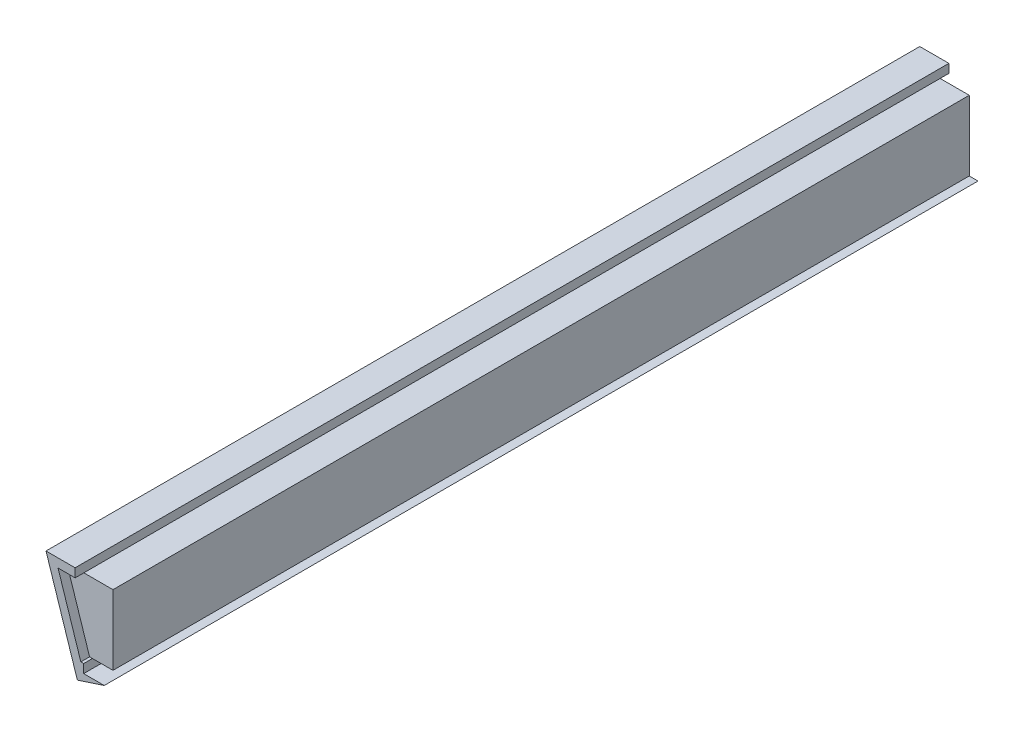
ISO-10303-21;
HEADER;
FILE_DESCRIPTION(('STEP AP214'),'2;1');
FILE_NAME('part.step','',(''),(''),'','','');
FILE_SCHEMA(('AUTOMOTIVE_DESIGN { 1 0 10303 214 1 1 1 1 }'));
ENDSEC;
DATA;
#1=APPLICATION_CONTEXT('core data for automotive mechanical design processes');
#2=APPLICATION_PROTOCOL_DEFINITION('international standard','automotive_design',2000,#1);
#3=PRODUCT_CONTEXT('',#1,'mechanical');
#4=PRODUCT('Part','Part','',(#3));
#5=PRODUCT_RELATED_PRODUCT_CATEGORY('part','',(#4));
#6=PRODUCT_DEFINITION_FORMATION('','',#4);
#7=PRODUCT_DEFINITION_CONTEXT('part definition',#1,'design');
#8=PRODUCT_DEFINITION('design','',#6,#7);
#9=PRODUCT_DEFINITION_SHAPE('','',#8);
#10=(LENGTH_UNIT() NAMED_UNIT(*) SI_UNIT(.MILLI.,.METRE.));
#11=(NAMED_UNIT(*) PLANE_ANGLE_UNIT() SI_UNIT($,.RADIAN.));
#12=(NAMED_UNIT(*) SI_UNIT($,.STERADIAN.) SOLID_ANGLE_UNIT());
#13=UNCERTAINTY_MEASURE_WITH_UNIT(LENGTH_MEASURE(1.E-05),#10,'distance_accuracy_value','');
#14=(GEOMETRIC_REPRESENTATION_CONTEXT(3) GLOBAL_UNCERTAINTY_ASSIGNED_CONTEXT((#13)) GLOBAL_UNIT_ASSIGNED_CONTEXT((#10,
#11,#12)) REPRESENTATION_CONTEXT('',''));
#15=CARTESIAN_POINT('',(0.,0.,0.));
#16=DIRECTION('',(0.,0.,1.));
#17=DIRECTION('',(1.,0.,0.));
#18=AXIS2_PLACEMENT_3D('',#15,#16,#17);
#19=CARTESIAN_POINT('',(0.,293.,-300.));
#20=DIRECTION('',(0.,-1.,0.));
#21=DIRECTION('',(0.,0.,-1.));
#22=AXIS2_PLACEMENT_3D('',#19,#20,#21);
#23=PLANE('',#22);
#24=DIRECTION('',(-1.,0.,0.));
#25=VECTOR('',#24,1.);
#26=CARTESIAN_POINT('',(0.,293.,-3.));
#27=LINE('',#26,#25);
#28=CARTESIAN_POINT('',(-85.9380792356703,293.,-3.));
#29=VERTEX_POINT('',#28);
#30=CARTESIAN_POINT('',(-95.9380792356703,293.,-3.));
#31=VERTEX_POINT('',#30);
#32=EDGE_CURVE('E256',#29,#31,#27,.T.);
#33=ORIENTED_EDGE('',*,*,#32,.F.);
#34=DIRECTION('',(0.,0.,1.));
#35=VECTOR('',#34,1.);
#36=CARTESIAN_POINT('',(-85.9380792356703,293.,-300.));
#37=LINE('',#36,#35);
#38=CARTESIAN_POINT('',(-85.9380792356703,293.,-297.));
#39=VERTEX_POINT('',#38);
#40=EDGE_CURVE('E151',#39,#29,#37,.T.);
#41=ORIENTED_EDGE('',*,*,#40,.F.);
#42=DIRECTION('',(-1.,0.,0.));
#43=VECTOR('',#42,1.);
#44=CARTESIAN_POINT('',(0.,293.,-297.));
#45=LINE('',#44,#43);
#46=CARTESIAN_POINT('',(-95.9380792356703,293.,-297.));
#47=VERTEX_POINT('',#46);
#48=EDGE_CURVE('E221',#39,#47,#45,.T.);
#49=ORIENTED_EDGE('',*,*,#48,.T.);
#50=DIRECTION('',(0.,0.,1.));
#51=VECTOR('',#50,1.);
#52=CARTESIAN_POINT('',(-95.9380792356703,293.,-300.));
#53=LINE('',#52,#51);
#54=EDGE_CURVE('E150',#47,#31,#53,.T.);
#55=ORIENTED_EDGE('',*,*,#54,.T.);
#56=EDGE_LOOP('',(#33,#41,#49,#55));
#57=FACE_BOUND('',#56,.T.);
#58=ADVANCED_FACE('F35',(#57),#23,.F.);
#59=CARTESIAN_POINT('',(-85.9380792356703,0.,-300.));
#60=DIRECTION('',(-1.,0.,0.));
#61=DIRECTION('',(0.,0.,1.));
#62=AXIS2_PLACEMENT_3D('',#59,#60,#61);
#63=PLANE('',#62);
#64=DIRECTION('',(0.,1.,0.));
#65=VECTOR('',#64,1.);
#66=CARTESIAN_POINT('',(-85.9380792356703,0.,-3.));
#67=LINE('',#66,#65);
#68=CARTESIAN_POINT('',(-85.9380792356703,269.,-3.));
#69=VERTEX_POINT('',#68);
#70=EDGE_CURVE('E275',#69,#29,#67,.T.);
#71=ORIENTED_EDGE('',*,*,#70,.F.);
#72=DIRECTION('',(0.,0.,1.));
#73=VECTOR('',#72,1.);
#74=CARTESIAN_POINT('',(-85.9380792356703,269.,-300.));
#75=LINE('',#74,#73);
#76=CARTESIAN_POINT('',(-85.9380792356703,269.,-297.));
#77=VERTEX_POINT('',#76);
#78=EDGE_CURVE('E154',#77,#69,#75,.T.);
#79=ORIENTED_EDGE('',*,*,#78,.F.);
#80=DIRECTION('',(0.,-1.,0.));
#81=VECTOR('',#80,1.);
#82=CARTESIAN_POINT('',(-85.9380792356703,0.,-297.));
#83=LINE('',#82,#81);
#84=EDGE_CURVE('E224',#39,#77,#83,.T.);
#85=ORIENTED_EDGE('',*,*,#84,.F.);
#86=ORIENTED_EDGE('',*,*,#40,.T.);
#87=EDGE_LOOP('',(#71,#79,#85,#86));
#88=FACE_BOUND('',#87,.T.);
#89=ADVANCED_FACE('F272',(#88),#63,.F.);
#90=CARTESIAN_POINT('',(0.,269.,-300.));
#91=DIRECTION('',(0.,1.,0.));
#92=DIRECTION('',(0.,0.,1.));
#93=AXIS2_PLACEMENT_3D('',#90,#91,#92);
#94=PLANE('',#93);
#95=DIRECTION('',(-1.,0.,0.));
#96=VECTOR('',#95,1.);
#97=CARTESIAN_POINT('',(0.,269.,-3.));
#98=LINE('',#97,#96);
#99=CARTESIAN_POINT('',(-93.0000000000001,269.,-3.));
#100=VERTEX_POINT('',#99);
#101=EDGE_CURVE('E202',#69,#100,#98,.T.);
#102=ORIENTED_EDGE('',*,*,#101,.T.);
#103=DIRECTION('',(0.,0.,1.));
#104=VECTOR('',#103,1.);
#105=CARTESIAN_POINT('',(-93.0000000000001,269.,-300.));
#106=LINE('',#105,#104);
#107=CARTESIAN_POINT('',(-93.0000000000001,269.,-297.));
#108=VERTEX_POINT('',#107);
#109=EDGE_CURVE('E160',#108,#100,#106,.T.);
#110=ORIENTED_EDGE('',*,*,#109,.F.);
#111=DIRECTION('',(-1.,0.,0.));
#112=VECTOR('',#111,1.);
#113=CARTESIAN_POINT('',(0.,269.,-297.));
#114=LINE('',#113,#112);
#115=EDGE_CURVE('E213',#77,#108,#114,.T.);
#116=ORIENTED_EDGE('',*,*,#115,.F.);
#117=ORIENTED_EDGE('',*,*,#78,.T.);
#118=EDGE_LOOP('',(#102,#110,#116,#117));
#119=FACE_BOUND('',#118,.T.);
#120=ADVANCED_FACE('F279',(#119),#94,.F.);
#121=CARTESIAN_POINT('',(0.,0.,0.));
#122=DIRECTION('',(0.,0.,1.));
#123=DIRECTION('',(1.,0.,0.));
#124=AXIS2_PLACEMENT_3D('',#121,#122,#123);
#125=PLANE('',#124);
#126=DIRECTION('',(0.,-1.,0.));
#127=VECTOR('',#126,1.);
#128=CARTESIAN_POINT('',(-93.0000000000001,0.,0.));
#129=LINE('',#128,#127);
#130=CARTESIAN_POINT('',(-93.0000000000001,269.,0.));
#131=VERTEX_POINT('',#130);
#132=CARTESIAN_POINT('',(-93.0000000000001,266.,0.));
#133=VERTEX_POINT('',#132);
#134=EDGE_CURVE('E138',#131,#133,#129,.T.);
#135=ORIENTED_EDGE('',*,*,#134,.F.);
#136=DIRECTION('',(-1.,0.,0.));
#137=VECTOR('',#136,1.);
#138=CARTESIAN_POINT('',(0.,269.,0.));
#139=LINE('',#138,#137);
#140=CARTESIAN_POINT('',(-93.9782608695652,269.,0.));
#141=VERTEX_POINT('',#140);
#142=EDGE_CURVE('E11',#131,#141,#139,.T.);
#143=ORIENTED_EDGE('',*,*,#142,.T.);
#144=DIRECTION('',(-0.310020599830913,0.95072983948148,0.));
#145=VECTOR('',#144,1.);
#146=CARTESIAN_POINT('',(-5.65912003417447,-1.84536522853513,0.));
#147=LINE('',#146,#145);
#148=CARTESIAN_POINT('',(-101.804347826087,293.,0.));
#149=VERTEX_POINT('',#148);
#150=EDGE_CURVE('E190',#141,#149,#147,.T.);
#151=ORIENTED_EDGE('',*,*,#150,.T.);
#152=DIRECTION('',(-1.,0.,0.));
#153=VECTOR('',#152,1.);
#154=CARTESIAN_POINT('',(0.,293.,0.));
#155=LINE('',#154,#153);
#156=CARTESIAN_POINT('',(-95.9380792356703,293.,0.));
#157=VERTEX_POINT('',#156);
#158=EDGE_CURVE('E43',#157,#149,#155,.T.);
#159=ORIENTED_EDGE('',*,*,#158,.F.);
#160=DIRECTION('',(0.,-1.,0.));
#161=VECTOR('',#160,1.);
#162=CARTESIAN_POINT('',(-95.9380792356703,0.,0.));
#163=LINE('',#162,#161);
#164=CARTESIAN_POINT('',(-95.9380792356703,296.,0.));
#165=VERTEX_POINT('',#164);
#166=EDGE_CURVE('E140',#165,#157,#163,.T.);
#167=ORIENTED_EDGE('',*,*,#166,.F.);
#168=DIRECTION('',(-1.,0.,0.));
#169=VECTOR('',#168,1.);
#170=CARTESIAN_POINT('',(0.,296.,0.));
#171=LINE('',#170,#169);
#172=CARTESIAN_POINT('',(-105.93807923567,296.,0.));
#173=VERTEX_POINT('',#172);
#174=EDGE_CURVE('E108',#165,#173,#171,.T.);
#175=ORIENTED_EDGE('',*,*,#174,.T.);
#176=DIRECTION('',(-0.310020599830914,0.95072983948148,0.));
#177=VECTOR('',#176,1.);
#178=CARTESIAN_POINT('',(-8.51130955261818,-2.77542702802764,0.));
#179=LINE('',#178,#177);
#180=CARTESIAN_POINT('',(-95.1734487358835,262.988466467322,0.));
#181=VERTEX_POINT('',#180);
#182=EDGE_CURVE('E87',#181,#173,#179,.T.);
#183=ORIENTED_EDGE('',*,*,#182,.F.);
#184=DIRECTION('',(-0.950729839481482,-0.310020599830907,0.));
#185=VECTOR('',#184,1.);
#186=CARTESIAN_POINT('',(-86.6621391832632,265.76389349535,0.));
#187=LINE('',#186,#185);
#188=CARTESIAN_POINT('',(-85.9380792356703,266.,0.));
#189=VERTEX_POINT('',#188);
#190=EDGE_CURVE('E132',#189,#181,#187,.T.);
#191=ORIENTED_EDGE('',*,*,#190,.F.);
#192=DIRECTION('',(1.,0.,0.));
#193=VECTOR('',#192,1.);
#194=CARTESIAN_POINT('',(0.,266.,0.));
#195=LINE('',#194,#193);
#196=EDGE_CURVE('E135',#133,#189,#195,.T.);
#197=ORIENTED_EDGE('',*,*,#196,.F.);
#198=EDGE_LOOP('',(#135,#143,#151,#159,#167,#175,#183,#191,#197));
#199=FACE_BOUND('',#198,.T.);
#200=ADVANCED_FACE('F197',(#199),#125,.T.);
#201=CARTESIAN_POINT('',(-86.6621391832632,265.76389349535,-300.));
#202=DIRECTION('',(-0.310020599830907,0.950729839481482,0.));
#203=DIRECTION('',(-0.950729839481482,-0.310020599830907,0.));
#204=AXIS2_PLACEMENT_3D('',#201,#202,#203);
#205=PLANE('',#204);
#206=ORIENTED_EDGE('',*,*,#190,.T.);
#207=DIRECTION('',(0.,0.,1.));
#208=VECTOR('',#207,1.);
#209=CARTESIAN_POINT('',(-95.1734487358835,262.988466467322,-300.));
#210=LINE('',#209,#208);
#211=CARTESIAN_POINT('',(-95.1734487358835,262.988466467322,-300.));
#212=VERTEX_POINT('',#211);
#213=EDGE_CURVE('E145',#212,#181,#210,.T.);
#214=ORIENTED_EDGE('',*,*,#213,.F.);
#215=DIRECTION('',(-0.950729839481482,-0.310020599830907,0.));
#216=VECTOR('',#215,1.);
#217=CARTESIAN_POINT('',(-86.6621391832632,265.76389349535,-300.));
#218=LINE('',#217,#216);
#219=CARTESIAN_POINT('',(-85.9380792356703,266.,-300.));
#220=VERTEX_POINT('',#219);
#221=EDGE_CURVE('E144',#220,#212,#218,.T.);
#222=ORIENTED_EDGE('',*,*,#221,.F.);
#223=DIRECTION('',(0.,0.,1.));
#224=VECTOR('',#223,1.);
#225=CARTESIAN_POINT('',(-85.9380792356703,266.,-300.));
#226=LINE('',#225,#224);
#227=EDGE_CURVE('E128',#220,#189,#226,.T.);
#228=ORIENTED_EDGE('',*,*,#227,.T.);
#229=EDGE_LOOP('',(#206,#214,#222,#228));
#230=FACE_BOUND('',#229,.T.);
#231=ADVANCED_FACE('F37',(#230),#205,.F.);
#232=CARTESIAN_POINT('',(-8.51130955261818,-2.77542702802764,-300.));
#233=DIRECTION('',(0.95072983948148,0.310020599830914,0.));
#234=DIRECTION('',(-0.310020599830914,0.95072983948148,0.));
#235=AXIS2_PLACEMENT_3D('',#232,#233,#234);
#236=PLANE('',#235);
#237=ORIENTED_EDGE('',*,*,#182,.T.);
#238=DIRECTION('',(0.,0.,1.));
#239=VECTOR('',#238,1.);
#240=CARTESIAN_POINT('',(-105.93807923567,296.,-300.));
#241=LINE('',#240,#239);
#242=CARTESIAN_POINT('',(-105.93807923567,296.,-300.));
#243=VERTEX_POINT('',#242);
#244=EDGE_CURVE('E112',#243,#173,#241,.T.);
#245=ORIENTED_EDGE('',*,*,#244,.F.);
#246=DIRECTION('',(-0.310020599830914,0.95072983948148,0.));
#247=VECTOR('',#246,1.);
#248=CARTESIAN_POINT('',(-8.51130955261818,-2.77542702802764,-300.));
#249=LINE('',#248,#247);
#250=EDGE_CURVE('E59',#212,#243,#249,.T.);
#251=ORIENTED_EDGE('',*,*,#250,.F.);
#252=ORIENTED_EDGE('',*,*,#213,.T.);
#253=EDGE_LOOP('',(#237,#245,#251,#252));
#254=FACE_BOUND('',#253,.T.);
#255=ADVANCED_FACE('F244',(#254),#236,.F.);
#256=CARTESIAN_POINT('',(0.,296.,-300.));
#257=DIRECTION('',(0.,1.,0.));
#258=DIRECTION('',(0.,0.,1.));
#259=AXIS2_PLACEMENT_3D('',#256,#257,#258);
#260=PLANE('',#259);
#261=ORIENTED_EDGE('',*,*,#174,.F.);
#262=DIRECTION('',(0.,0.,1.));
#263=VECTOR('',#262,1.);
#264=CARTESIAN_POINT('',(-95.9380792356703,296.,-300.));
#265=LINE('',#264,#263);
#266=CARTESIAN_POINT('',(-95.9380792356703,296.,-300.));
#267=VERTEX_POINT('',#266);
#268=EDGE_CURVE('E103',#267,#165,#265,.T.);
#269=ORIENTED_EDGE('',*,*,#268,.F.);
#270=DIRECTION('',(-1.,0.,0.));
#271=VECTOR('',#270,1.);
#272=CARTESIAN_POINT('',(0.,296.,-300.));
#273=LINE('',#272,#271);
#274=EDGE_CURVE('E107',#267,#243,#273,.T.);
#275=ORIENTED_EDGE('',*,*,#274,.T.);
#276=ORIENTED_EDGE('',*,*,#244,.T.);
#277=EDGE_LOOP('',(#261,#269,#275,#276));
#278=FACE_BOUND('',#277,.T.);
#279=ADVANCED_FACE('F105',(#278),#260,.T.);
#280=CARTESIAN_POINT('',(-95.9380792356703,0.,-300.));
#281=DIRECTION('',(-1.,0.,0.));
#282=DIRECTION('',(0.,0.,1.));
#283=AXIS2_PLACEMENT_3D('',#280,#281,#282);
#284=PLANE('',#283);
#285=ORIENTED_EDGE('',*,*,#166,.T.);
#286=DIRECTION('',(0.,0.,-1.));
#287=VECTOR('',#286,1.);
#288=CARTESIAN_POINT('',(-95.9380792356703,293.,-300.));
#289=LINE('',#288,#287);
#290=EDGE_CURVE('E181',#157,#31,#289,.T.);
#291=ORIENTED_EDGE('',*,*,#290,.T.);
#292=ORIENTED_EDGE('',*,*,#54,.F.);
#293=CARTESIAN_POINT('',(-95.9380792356703,293.,-300.));
#294=VERTEX_POINT('',#293);
#295=EDGE_CURVE('E113',#294,#47,#53,.T.);
#296=ORIENTED_EDGE('',*,*,#295,.F.);
#297=DIRECTION('',(0.,-1.,0.));
#298=VECTOR('',#297,1.);
#299=CARTESIAN_POINT('',(-95.9380792356703,0.,-300.));
#300=LINE('',#299,#298);
#301=EDGE_CURVE('E117',#267,#294,#300,.T.);
#302=ORIENTED_EDGE('',*,*,#301,.F.);
#303=ORIENTED_EDGE('',*,*,#268,.T.);
#304=EDGE_LOOP('',(#285,#291,#292,#296,#302,#303));
#305=FACE_BOUND('',#304,.T.);
#306=ADVANCED_FACE('F118',(#305),#284,.F.);
#307=CARTESIAN_POINT('',(-93.0000000000001,0.,-300.));
#308=DIRECTION('',(-1.,0.,0.));
#309=DIRECTION('',(0.,0.,1.));
#310=AXIS2_PLACEMENT_3D('',#307,#308,#309);
#311=PLANE('',#310);
#312=ORIENTED_EDGE('',*,*,#134,.T.);
#313=DIRECTION('',(0.,0.,1.));
#314=VECTOR('',#313,1.);
#315=CARTESIAN_POINT('',(-93.0000000000001,266.,-300.));
#316=LINE('',#315,#314);
#317=CARTESIAN_POINT('',(-93.0000000000001,266.,-300.));
#318=VERTEX_POINT('',#317);
#319=EDGE_CURVE('E161',#318,#133,#316,.T.);
#320=ORIENTED_EDGE('',*,*,#319,.F.);
#321=DIRECTION('',(0.,-1.,0.));
#322=VECTOR('',#321,1.);
#323=CARTESIAN_POINT('',(-93.0000000000001,0.,-300.));
#324=LINE('',#323,#322);
#325=CARTESIAN_POINT('',(-93.0000000000001,269.,-300.));
#326=VERTEX_POINT('',#325);
#327=EDGE_CURVE('E123',#326,#318,#324,.T.);
#328=ORIENTED_EDGE('',*,*,#327,.F.);
#329=EDGE_CURVE('E157',#326,#108,#106,.T.);
#330=ORIENTED_EDGE('',*,*,#329,.T.);
#331=ORIENTED_EDGE('',*,*,#109,.T.);
#332=DIRECTION('',(0.,0.,-1.));
#333=VECTOR('',#332,1.);
#334=CARTESIAN_POINT('',(-93.0000000000001,269.,-300.));
#335=LINE('',#334,#333);
#336=EDGE_CURVE('E209',#131,#100,#335,.T.);
#337=ORIENTED_EDGE('',*,*,#336,.F.);
#338=EDGE_LOOP('',(#312,#320,#328,#330,#331,#337));
#339=FACE_BOUND('',#338,.T.);
#340=ADVANCED_FACE('F236',(#339),#311,.F.);
#341=CARTESIAN_POINT('',(0.,266.,-300.));
#342=DIRECTION('',(0.,-1.,0.));
#343=DIRECTION('',(0.,0.,-1.));
#344=AXIS2_PLACEMENT_3D('',#341,#342,#343);
#345=PLANE('',#344);
#346=ORIENTED_EDGE('',*,*,#196,.T.);
#347=ORIENTED_EDGE('',*,*,#227,.F.);
#348=DIRECTION('',(1.,0.,0.));
#349=VECTOR('',#348,1.);
#350=CARTESIAN_POINT('',(0.,266.,-300.));
#351=LINE('',#350,#349);
#352=EDGE_CURVE('E94',#318,#220,#351,.T.);
#353=ORIENTED_EDGE('',*,*,#352,.F.);
#354=ORIENTED_EDGE('',*,*,#319,.T.);
#355=EDGE_LOOP('',(#346,#347,#353,#354));
#356=FACE_BOUND('',#355,.T.);
#357=ADVANCED_FACE('F240',(#356),#345,.F.);
#358=CARTESIAN_POINT('',(0.,0.,-300.));
#359=DIRECTION('',(0.,0.,1.));
#360=DIRECTION('',(1.,0.,0.));
#361=AXIS2_PLACEMENT_3D('',#358,#359,#360);
#362=PLANE('',#361);
#363=DIRECTION('',(-0.310020599830914,0.95072983948148,0.));
#364=VECTOR('',#363,1.);
#365=CARTESIAN_POINT('',(-5.65912003417437,-1.8453652285351,-300.));
#366=LINE('',#365,#364);
#367=CARTESIAN_POINT('',(-93.9782608695652,269.,-300.));
#368=VERTEX_POINT('',#367);
#369=CARTESIAN_POINT('',(-101.804347826087,293.,-300.));
#370=VERTEX_POINT('',#369);
#371=EDGE_CURVE('E212',#368,#370,#366,.T.);
#372=ORIENTED_EDGE('',*,*,#371,.F.);
#373=DIRECTION('',(1.,0.,0.));
#374=VECTOR('',#373,1.);
#375=CARTESIAN_POINT('',(0.,269.,-300.));
#376=LINE('',#375,#374);
#377=EDGE_CURVE('E168',#368,#326,#376,.T.);
#378=ORIENTED_EDGE('',*,*,#377,.T.);
#379=ORIENTED_EDGE('',*,*,#327,.T.);
#380=ORIENTED_EDGE('',*,*,#352,.T.);
#381=ORIENTED_EDGE('',*,*,#221,.T.);
#382=ORIENTED_EDGE('',*,*,#250,.T.);
#383=ORIENTED_EDGE('',*,*,#274,.F.);
#384=ORIENTED_EDGE('',*,*,#301,.T.);
#385=DIRECTION('',(1.,0.,0.));
#386=VECTOR('',#385,1.);
#387=CARTESIAN_POINT('',(0.,293.,-300.));
#388=LINE('',#387,#386);
#389=EDGE_CURVE('E147',#370,#294,#388,.T.);
#390=ORIENTED_EDGE('',*,*,#389,.F.);
#391=EDGE_LOOP('',(#372,#378,#379,#380,#381,#382,#383,#384,#390));
#392=FACE_BOUND('',#391,.T.);
#393=ADVANCED_FACE('F126',(#392),#362,.F.);
#394=CARTESIAN_POINT('',(0.,269.,-297.));
#395=DIRECTION('',(0.,-1.,0.));
#396=DIRECTION('',(0.,0.,-1.));
#397=AXIS2_PLACEMENT_3D('',#394,#395,#396);
#398=PLANE('',#397);
#399=ORIENTED_EDGE('',*,*,#377,.F.);
#400=DIRECTION('',(0.,0.,-1.));
#401=VECTOR('',#400,1.);
#402=CARTESIAN_POINT('',(-93.9782608695652,269.,-297.));
#403=LINE('',#402,#401);
#404=CARTESIAN_POINT('',(-93.9782608695652,269.,-297.));
#405=VERTEX_POINT('',#404);
#406=EDGE_CURVE('E50',#405,#368,#403,.T.);
#407=ORIENTED_EDGE('',*,*,#406,.F.);
#408=EDGE_CURVE('E217',#108,#405,#114,.T.);
#409=ORIENTED_EDGE('',*,*,#408,.F.);
#410=ORIENTED_EDGE('',*,*,#329,.F.);
#411=EDGE_LOOP('',(#399,#407,#409,#410));
#412=FACE_BOUND('',#411,.T.);
#413=ADVANCED_FACE('F304',(#412),#398,.F.);
#414=CARTESIAN_POINT('',(0.,293.,-297.));
#415=DIRECTION('',(0.,-1.,0.));
#416=DIRECTION('',(0.,0.,-1.));
#417=AXIS2_PLACEMENT_3D('',#414,#415,#416);
#418=PLANE('',#417);
#419=ORIENTED_EDGE('',*,*,#295,.T.);
#420=CARTESIAN_POINT('',(-101.804347826087,293.,-297.));
#421=VERTEX_POINT('',#420);
#422=EDGE_CURVE('E220',#47,#421,#45,.T.);
#423=ORIENTED_EDGE('',*,*,#422,.T.);
#424=DIRECTION('',(0.,0.,-1.));
#425=VECTOR('',#424,1.);
#426=CARTESIAN_POINT('',(-101.804347826087,293.,-297.));
#427=LINE('',#426,#425);
#428=EDGE_CURVE('E136',#421,#370,#427,.T.);
#429=ORIENTED_EDGE('',*,*,#428,.T.);
#430=ORIENTED_EDGE('',*,*,#389,.T.);
#431=EDGE_LOOP('',(#419,#423,#429,#430));
#432=FACE_BOUND('',#431,.T.);
#433=ADVANCED_FACE('F336',(#432),#418,.T.);
#434=CARTESIAN_POINT('',(-5.65912003417437,-1.8453652285351,-297.));
#435=DIRECTION('',(-0.95072983948148,-0.310020599830914,0.));
#436=DIRECTION('',(0.310020599830914,-0.95072983948148,0.));
#437=AXIS2_PLACEMENT_3D('',#434,#435,#436);
#438=PLANE('',#437);
#439=ORIENTED_EDGE('',*,*,#371,.T.);
#440=ORIENTED_EDGE('',*,*,#428,.F.);
#441=DIRECTION('',(-0.310020599830914,0.95072983948148,0.));
#442=VECTOR('',#441,1.);
#443=CARTESIAN_POINT('',(-5.65912003417437,-1.8453652285351,-297.));
#444=LINE('',#443,#442);
#445=EDGE_CURVE('E216',#405,#421,#444,.T.);
#446=ORIENTED_EDGE('',*,*,#445,.F.);
#447=ORIENTED_EDGE('',*,*,#406,.T.);
#448=EDGE_LOOP('',(#439,#440,#446,#447));
#449=FACE_BOUND('',#448,.T.);
#450=ADVANCED_FACE('F392',(#449),#438,.F.);
#451=CARTESIAN_POINT('',(0.,0.,-297.));
#452=DIRECTION('',(0.,0.,-1.));
#453=DIRECTION('',(-1.,0.,0.));
#454=AXIS2_PLACEMENT_3D('',#451,#452,#453);
#455=PLANE('',#454);
#456=ORIENTED_EDGE('',*,*,#115,.T.);
#457=ORIENTED_EDGE('',*,*,#408,.T.);
#458=ORIENTED_EDGE('',*,*,#445,.T.);
#459=ORIENTED_EDGE('',*,*,#422,.F.);
#460=ORIENTED_EDGE('',*,*,#48,.F.);
#461=ORIENTED_EDGE('',*,*,#84,.T.);
#462=EDGE_LOOP('',(#456,#457,#458,#459,#460,#461));
#463=FACE_BOUND('',#462,.T.);
#464=ADVANCED_FACE('F263',(#463),#455,.T.);
#465=CARTESIAN_POINT('',(0.,269.,-3.));
#466=DIRECTION('',(0.,1.,0.));
#467=DIRECTION('',(0.,0.,1.));
#468=AXIS2_PLACEMENT_3D('',#465,#466,#467);
#469=PLANE('',#468);
#470=ORIENTED_EDGE('',*,*,#336,.T.);
#471=CARTESIAN_POINT('',(-93.9782608695652,269.,-3.));
#472=VERTEX_POINT('',#471);
#473=EDGE_CURVE('E199',#100,#472,#98,.T.);
#474=ORIENTED_EDGE('',*,*,#473,.T.);
#475=DIRECTION('',(0.,0.,1.));
#476=VECTOR('',#475,1.);
#477=CARTESIAN_POINT('',(-93.9782608695652,269.,-3.));
#478=LINE('',#477,#476);
#479=EDGE_CURVE('E194',#472,#141,#478,.T.);
#480=ORIENTED_EDGE('',*,*,#479,.T.);
#481=ORIENTED_EDGE('',*,*,#142,.F.);
#482=EDGE_LOOP('',(#470,#474,#480,#481));
#483=FACE_BOUND('',#482,.T.);
#484=ADVANCED_FACE('F306',(#483),#469,.T.);
#485=CARTESIAN_POINT('',(0.,293.,-3.));
#486=DIRECTION('',(0.,1.,0.));
#487=DIRECTION('',(0.,0.,1.));
#488=AXIS2_PLACEMENT_3D('',#485,#486,#487);
#489=PLANE('',#488);
#490=ORIENTED_EDGE('',*,*,#158,.T.);
#491=DIRECTION('',(0.,0.,1.));
#492=VECTOR('',#491,1.);
#493=CARTESIAN_POINT('',(-101.804347826087,293.,-3.));
#494=LINE('',#493,#492);
#495=CARTESIAN_POINT('',(-101.804347826087,293.,-3.));
#496=VERTEX_POINT('',#495);
#497=EDGE_CURVE('E179',#496,#149,#494,.T.);
#498=ORIENTED_EDGE('',*,*,#497,.F.);
#499=EDGE_CURVE('E308',#31,#496,#27,.T.);
#500=ORIENTED_EDGE('',*,*,#499,.F.);
#501=ORIENTED_EDGE('',*,*,#290,.F.);
#502=EDGE_LOOP('',(#490,#498,#500,#501));
#503=FACE_BOUND('',#502,.T.);
#504=ADVANCED_FACE('F176',(#503),#489,.F.);
#505=CARTESIAN_POINT('',(-5.65912003417447,-1.84536522853513,-3.));
#506=DIRECTION('',(0.95072983948148,0.310020599830913,0.));
#507=DIRECTION('',(-0.310020599830913,0.95072983948148,0.));
#508=AXIS2_PLACEMENT_3D('',#505,#506,#507);
#509=PLANE('',#508);
#510=ORIENTED_EDGE('',*,*,#150,.F.);
#511=ORIENTED_EDGE('',*,*,#479,.F.);
#512=DIRECTION('',(-0.310020599830913,0.95072983948148,0.));
#513=VECTOR('',#512,1.);
#514=CARTESIAN_POINT('',(-5.65912003417447,-1.84536522853513,-3.));
#515=LINE('',#514,#513);
#516=EDGE_CURVE('E193',#472,#496,#515,.T.);
#517=ORIENTED_EDGE('',*,*,#516,.T.);
#518=ORIENTED_EDGE('',*,*,#497,.T.);
#519=EDGE_LOOP('',(#510,#511,#517,#518));
#520=FACE_BOUND('',#519,.T.);
#521=ADVANCED_FACE('F188',(#520),#509,.T.);
#522=CARTESIAN_POINT('',(0.,0.,-3.));
#523=DIRECTION('',(0.,0.,1.));
#524=DIRECTION('',(1.,0.,0.));
#525=AXIS2_PLACEMENT_3D('',#522,#523,#524);
#526=PLANE('',#525);
#527=ORIENTED_EDGE('',*,*,#101,.F.);
#528=ORIENTED_EDGE('',*,*,#70,.T.);
#529=ORIENTED_EDGE('',*,*,#32,.T.);
#530=ORIENTED_EDGE('',*,*,#499,.T.);
#531=ORIENTED_EDGE('',*,*,#516,.F.);
#532=ORIENTED_EDGE('',*,*,#473,.F.);
#533=EDGE_LOOP('',(#527,#528,#529,#530,#531,#532));
#534=FACE_BOUND('',#533,.T.);
#535=ADVANCED_FACE('F307',(#534),#526,.T.);
#536=CLOSED_SHELL('',(#58,#89,#120,#200,#231,#255,#279,#306,#340,#357,#393,#413,#433,#450,#464,
#484,#504,#521,#535));
#537=MANIFOLD_SOLID_BREP('B2',#536);
#538=ADVANCED_BREP_SHAPE_REPRESENTATION('',(#18,#537),#14);
#539=SHAPE_DEFINITION_REPRESENTATION(#9,#538);
ENDSEC;
END-ISO-10303-21;
